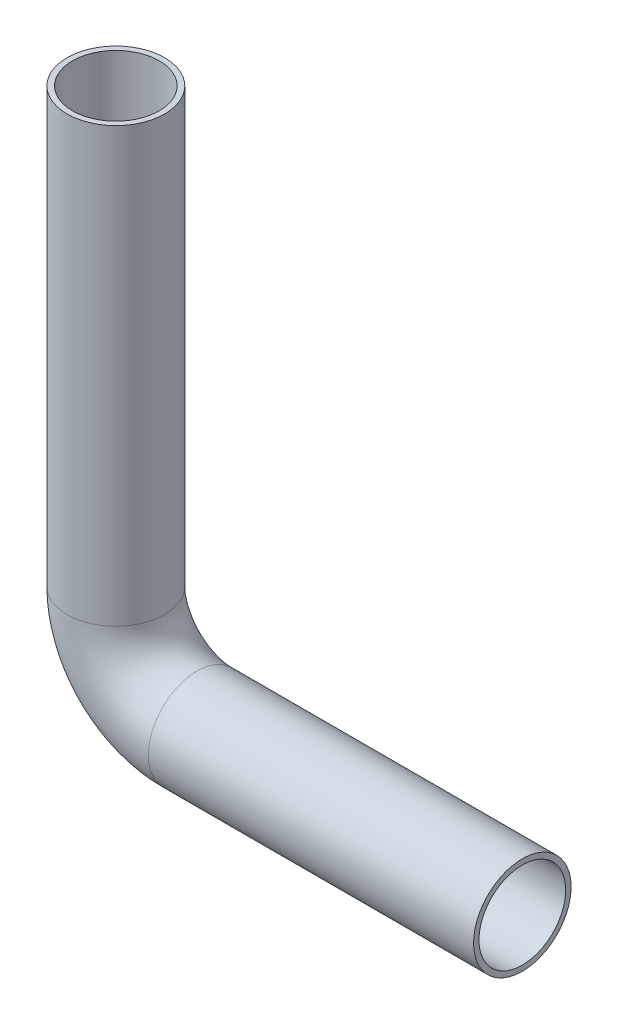
ISO-10303-21;
HEADER;
FILE_DESCRIPTION(('STEP AP214'),'2;1');
FILE_NAME('part.step','',(''),(''),'','','');
FILE_SCHEMA(('AUTOMOTIVE_DESIGN { 1 0 10303 214 1 1 1 1 }'));
ENDSEC;
DATA;
#1=APPLICATION_CONTEXT('core data for automotive mechanical design processes');
#2=APPLICATION_PROTOCOL_DEFINITION('international standard','automotive_design',2000,#1);
#3=PRODUCT_CONTEXT('',#1,'mechanical');
#4=PRODUCT('Part','Part','',(#3));
#5=PRODUCT_RELATED_PRODUCT_CATEGORY('part','',(#4));
#6=PRODUCT_DEFINITION_FORMATION('','',#4);
#7=PRODUCT_DEFINITION_CONTEXT('part definition',#1,'design');
#8=PRODUCT_DEFINITION('design','',#6,#7);
#9=PRODUCT_DEFINITION_SHAPE('','',#8);
#10=(LENGTH_UNIT() NAMED_UNIT(*) SI_UNIT(.MILLI.,.METRE.));
#11=(NAMED_UNIT(*) PLANE_ANGLE_UNIT() SI_UNIT($,.RADIAN.));
#12=(NAMED_UNIT(*) SI_UNIT($,.STERADIAN.) SOLID_ANGLE_UNIT());
#13=UNCERTAINTY_MEASURE_WITH_UNIT(LENGTH_MEASURE(1.E-05),#10,'distance_accuracy_value','');
#14=(GEOMETRIC_REPRESENTATION_CONTEXT(3) GLOBAL_UNCERTAINTY_ASSIGNED_CONTEXT((#13)) GLOBAL_UNIT_ASSIGNED_CONTEXT((#10,
#11,#12)) REPRESENTATION_CONTEXT('',''));
#15=CARTESIAN_POINT('',(0.,0.,0.));
#16=DIRECTION('',(0.,0.,1.));
#17=DIRECTION('',(1.,0.,0.));
#18=AXIS2_PLACEMENT_3D('',#15,#16,#17);
#19=CARTESIAN_POINT('',(-87.1143866378179,-56.3389719381065,0.));
#20=DIRECTION('',(1.,0.,0.));
#21=DIRECTION('',(0.,0.,-1.));
#22=AXIS2_PLACEMENT_3D('',#19,#20,#21);
#23=CYLINDRICAL_SURFACE('',#22,9.);
#24=CARTESIAN_POINT('',(-87.1143866378179,-56.3389719381065,0.));
#25=DIRECTION('',(-1.,0.,0.));
#26=DIRECTION('',(0.,0.,1.));
#27=AXIS2_PLACEMENT_3D('',#24,#25,#26);
#28=CIRCLE('',#27,9.);
#29=CARTESIAN_POINT('',(-87.1143866378179,-65.3389719381065,0.));
#30=VERTEX_POINT('',#29);
#31=EDGE_CURVE('E37',#30,#30,#28,.T.);
#32=ORIENTED_EDGE('',*,*,#31,.F.);
#33=EDGE_LOOP('',(#32));
#34=FACE_BOUND('',#33,.T.);
#35=CARTESIAN_POINT('',(-27.114386637818,-56.3389719381065,0.));
#36=DIRECTION('',(-1.,0.,0.));
#37=DIRECTION('',(0.,0.,1.));
#38=AXIS2_PLACEMENT_3D('',#35,#36,#37);
#39=CIRCLE('',#38,9.);
#40=CARTESIAN_POINT('',(-27.114386637818,-56.3389719381065,9.));
#41=VERTEX_POINT('',#40);
#42=EDGE_CURVE('E10',#41,#41,#39,.T.);
#43=ORIENTED_EDGE('',*,*,#42,.T.);
#44=EDGE_LOOP('',(#43));
#45=FACE_BOUND('',#44,.T.);
#46=ADVANCED_FACE('F31',(#34,#45),#23,.T.);
#47=CARTESIAN_POINT('',(-87.114386637818,-41.3389719381065,0.));
#48=DIRECTION('',(0.,0.,1.));
#49=DIRECTION('',(1.,0.,0.));
#50=AXIS2_PLACEMENT_3D('',#47,#48,#49);
#51=TOROIDAL_SURFACE('',#50,15.,9.);
#52=CARTESIAN_POINT('',(-102.114386637818,-41.3389719381064,0.));
#53=DIRECTION('',(0.,1.,0.));
#54=DIRECTION('',(0.,0.,1.));
#55=AXIS2_PLACEMENT_3D('',#52,#53,#54);
#56=CIRCLE('',#55,9.);
#57=CARTESIAN_POINT('',(-111.114386637818,-41.3389719381063,0.));
#58=VERTEX_POINT('',#57);
#59=EDGE_CURVE('E41',#58,#58,#56,.T.);
#60=CARTESIAN_POINT('',(-87.114386637818,-41.3389719381065,0.));
#61=DIRECTION('',(0.,0.,1.));
#62=DIRECTION('',(1.,0.,0.));
#63=AXIS2_PLACEMENT_3D('',#60,#61,#62);
#64=CIRCLE('',#63,24.);
#65=EDGE_CURVE('',#58,#30,#64,.T.);
#66=ORIENTED_EDGE('',*,*,#59,.F.);
#67=ORIENTED_EDGE('',*,*,#31,.T.);
#68=ORIENTED_EDGE('',*,*,#65,.T.);
#69=ORIENTED_EDGE('',*,*,#65,.F.);
#70=EDGE_LOOP('',(#66,#68,#67,#69));
#71=FACE_BOUND('',#70,.T.);
#72=ADVANCED_FACE('F80',(#71),#51,.T.);
#73=CARTESIAN_POINT('',(-102.114386637818,-41.3389719381064,0.));
#74=DIRECTION('',(0.,1.,0.));
#75=DIRECTION('',(0.,0.,1.));
#76=AXIS2_PLACEMENT_3D('',#73,#74,#75);
#77=CYLINDRICAL_SURFACE('',#76,9.);
#78=ORIENTED_EDGE('',*,*,#59,.T.);
#79=EDGE_LOOP('',(#78));
#80=FACE_BOUND('',#79,.T.);
#81=CARTESIAN_POINT('',(-102.114386637818,38.6610280618935,0.));
#82=DIRECTION('',(0.,1.,0.));
#83=DIRECTION('',(0.,0.,1.));
#84=AXIS2_PLACEMENT_3D('',#81,#82,#83);
#85=CIRCLE('',#84,9.);
#86=CARTESIAN_POINT('',(-102.114386637818,38.6610280618935,9.));
#87=VERTEX_POINT('',#86);
#88=EDGE_CURVE('E45',#87,#87,#85,.T.);
#89=ORIENTED_EDGE('',*,*,#88,.F.);
#90=EDGE_LOOP('',(#89));
#91=FACE_BOUND('',#90,.T.);
#92=ADVANCED_FACE('F85',(#80,#91),#77,.T.);
#93=CARTESIAN_POINT('',(-27.114386637818,-56.3389719381065,0.));
#94=DIRECTION('',(-1.,0.,0.));
#95=DIRECTION('',(0.,0.,1.));
#96=AXIS2_PLACEMENT_3D('',#93,#94,#95);
#97=PLANE('',#96);
#98=CARTESIAN_POINT('',(-27.114386637818,-56.3389719381065,0.));
#99=DIRECTION('',(-1.,0.,0.));
#100=DIRECTION('',(0.,-1.,0.));
#101=AXIS2_PLACEMENT_3D('',#98,#99,#100);
#102=CIRCLE('',#101,8.);
#103=CARTESIAN_POINT('',(-27.1143866378179,-64.3389719381065,0.));
#104=VERTEX_POINT('',#103);
#105=EDGE_CURVE('E49',#104,#104,#102,.T.);
#106=ORIENTED_EDGE('',*,*,#105,.T.);
#107=EDGE_LOOP('',(#106));
#108=FACE_BOUND('',#107,.T.);
#109=ORIENTED_EDGE('',*,*,#42,.F.);
#110=EDGE_LOOP('',(#109));
#111=FACE_BOUND('',#110,.T.);
#112=ADVANCED_FACE('F90',(#108,#111),#97,.F.);
#113=CARTESIAN_POINT('',(-102.114386637818,38.6610280618935,0.));
#114=DIRECTION('',(0.,1.,0.));
#115=DIRECTION('',(0.,0.,1.));
#116=AXIS2_PLACEMENT_3D('',#113,#114,#115);
#117=PLANE('',#116);
#118=CARTESIAN_POINT('',(-102.114386637818,38.6610280618935,0.));
#119=DIRECTION('',(0.,1.,0.));
#120=DIRECTION('',(0.,0.,1.));
#121=AXIS2_PLACEMENT_3D('',#118,#119,#120);
#122=CIRCLE('',#121,8.);
#123=CARTESIAN_POINT('',(-102.114386637818,38.6610280618935,8.));
#124=VERTEX_POINT('',#123);
#125=EDGE_CURVE('E51',#124,#124,#122,.T.);
#126=ORIENTED_EDGE('',*,*,#125,.F.);
#127=EDGE_LOOP('',(#126));
#128=FACE_BOUND('',#127,.T.);
#129=ORIENTED_EDGE('',*,*,#88,.T.);
#130=EDGE_LOOP('',(#129));
#131=FACE_BOUND('',#130,.T.);
#132=ADVANCED_FACE('F77',(#128,#131),#117,.T.);
#133=CARTESIAN_POINT('',(-87.1143866378179,-56.3389719381065,0.));
#134=DIRECTION('',(1.,0.,0.));
#135=DIRECTION('',(0.,0.,-1.));
#136=AXIS2_PLACEMENT_3D('',#133,#134,#135);
#137=CYLINDRICAL_SURFACE('',#136,8.);
#138=CARTESIAN_POINT('',(-87.1143866378179,-56.3389719381065,0.));
#139=DIRECTION('',(-1.,0.,0.));
#140=DIRECTION('',(0.,-1.,0.));
#141=AXIS2_PLACEMENT_3D('',#138,#139,#140);
#142=CIRCLE('',#141,8.);
#143=CARTESIAN_POINT('',(-87.1143866378179,-64.3389719381065,0.));
#144=VERTEX_POINT('',#143);
#145=EDGE_CURVE('E57',#144,#144,#142,.T.);
#146=ORIENTED_EDGE('',*,*,#145,.T.);
#147=EDGE_LOOP('',(#146));
#148=FACE_BOUND('',#147,.T.);
#149=ORIENTED_EDGE('',*,*,#105,.F.);
#150=EDGE_LOOP('',(#149));
#151=FACE_BOUND('',#150,.T.);
#152=ADVANCED_FACE('F63',(#148,#151),#137,.F.);
#153=CARTESIAN_POINT('',(-87.114386637818,-41.3389719381065,0.));
#154=DIRECTION('',(0.,0.,1.));
#155=DIRECTION('',(1.,0.,0.));
#156=AXIS2_PLACEMENT_3D('',#153,#154,#155);
#157=TOROIDAL_SURFACE('',#156,15.,8.);
#158=CARTESIAN_POINT('',(-102.114386637818,-41.3389719381064,0.));
#159=DIRECTION('',(0.,1.,0.));
#160=DIRECTION('',(0.,0.,1.));
#161=AXIS2_PLACEMENT_3D('',#158,#159,#160);
#162=CIRCLE('',#161,8.);
#163=CARTESIAN_POINT('',(-110.114386637818,-41.3389719381063,0.));
#164=VERTEX_POINT('',#163);
#165=EDGE_CURVE('E54',#164,#164,#162,.T.);
#166=CARTESIAN_POINT('',(-87.114386637818,-41.3389719381065,0.));
#167=DIRECTION('',(0.,0.,1.));
#168=DIRECTION('',(1.,0.,0.));
#169=AXIS2_PLACEMENT_3D('',#166,#167,#168);
#170=CIRCLE('',#169,23.);
#171=EDGE_CURVE('',#164,#144,#170,.T.);
#172=ORIENTED_EDGE('',*,*,#165,.T.);
#173=ORIENTED_EDGE('',*,*,#145,.F.);
#174=ORIENTED_EDGE('',*,*,#171,.T.);
#175=ORIENTED_EDGE('',*,*,#171,.F.);
#176=EDGE_LOOP('',(#172,#174,#173,#175));
#177=FACE_BOUND('',#176,.T.);
#178=ADVANCED_FACE('F66',(#177),#157,.F.);
#179=CARTESIAN_POINT('',(-102.114386637818,-41.3389719381064,0.));
#180=DIRECTION('',(0.,1.,0.));
#181=DIRECTION('',(0.,0.,1.));
#182=AXIS2_PLACEMENT_3D('',#179,#180,#181);
#183=CYLINDRICAL_SURFACE('',#182,8.);
#184=ORIENTED_EDGE('',*,*,#165,.F.);
#185=EDGE_LOOP('',(#184));
#186=FACE_BOUND('',#185,.T.);
#187=ORIENTED_EDGE('',*,*,#125,.T.);
#188=EDGE_LOOP('',(#187));
#189=FACE_BOUND('',#188,.T.);
#190=ADVANCED_FACE('F68',(#186,#189),#183,.F.);
#191=CLOSED_SHELL('',(#46,#72,#92,#112,#132,#152,#178,#190));
#192=MANIFOLD_SOLID_BREP('B2',#191);
#193=ADVANCED_BREP_SHAPE_REPRESENTATION('',(#18,#192),#14);
#194=SHAPE_DEFINITION_REPRESENTATION(#9,#193);
ENDSEC;
END-ISO-10303-21;
